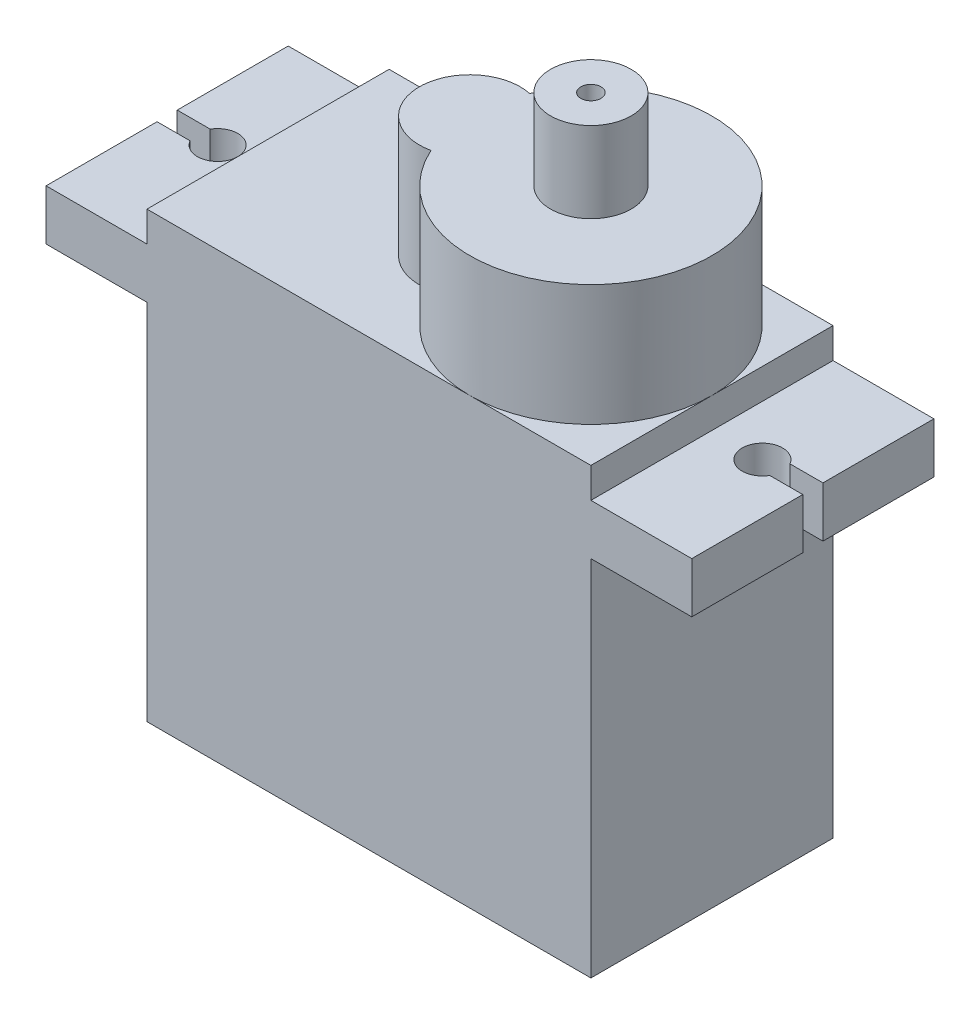
ISO-10303-21;
HEADER;
FILE_DESCRIPTION(('STEP AP214'),'2;1');
FILE_NAME('part.step','',(''),(''),'','','');
FILE_SCHEMA(('AUTOMOTIVE_DESIGN { 1 0 10303 214 1 1 1 1 }'));
ENDSEC;
DATA;
#1=APPLICATION_CONTEXT('core data for automotive mechanical design processes');
#2=APPLICATION_PROTOCOL_DEFINITION('international standard','automotive_design',2000,#1);
#3=PRODUCT_CONTEXT('',#1,'mechanical');
#4=PRODUCT('Part','Part','',(#3));
#5=PRODUCT_RELATED_PRODUCT_CATEGORY('part','',(#4));
#6=PRODUCT_DEFINITION_FORMATION('','',#4);
#7=PRODUCT_DEFINITION_CONTEXT('part definition',#1,'design');
#8=PRODUCT_DEFINITION('design','',#6,#7);
#9=PRODUCT_DEFINITION_SHAPE('','',#8);
#10=(LENGTH_UNIT() NAMED_UNIT(*) SI_UNIT(.MILLI.,.METRE.));
#11=(NAMED_UNIT(*) PLANE_ANGLE_UNIT() SI_UNIT($,.RADIAN.));
#12=(NAMED_UNIT(*) SI_UNIT($,.STERADIAN.) SOLID_ANGLE_UNIT());
#13=UNCERTAINTY_MEASURE_WITH_UNIT(LENGTH_MEASURE(1.E-05),#10,'distance_accuracy_value','');
#14=(GEOMETRIC_REPRESENTATION_CONTEXT(3) GLOBAL_UNCERTAINTY_ASSIGNED_CONTEXT((#13)) GLOBAL_UNIT_ASSIGNED_CONTEXT((#10,
#11,#12)) REPRESENTATION_CONTEXT('',''));
#15=CARTESIAN_POINT('',(0.,0.,0.));
#16=DIRECTION('',(0.,0.,1.));
#17=DIRECTION('',(1.,0.,0.));
#18=AXIS2_PLACEMENT_3D('',#15,#16,#17);
#19=CARTESIAN_POINT('',(-16.,3.90909090909092,12.));
#20=DIRECTION('',(0.,-1.,0.));
#21=DIRECTION('',(0.,0.,-1.));
#22=AXIS2_PLACEMENT_3D('',#19,#20,#21);
#23=PLANE('',#22);
#24=DIRECTION('',(-1.,0.,0.));
#25=VECTOR('',#24,1.);
#26=CARTESIAN_POINT('',(-14.3660254037844,3.90909090909092,6.5));
#27=LINE('',#26,#25);
#28=CARTESIAN_POINT('',(-14.3660254037844,3.90909090909092,6.5));
#29=VERTEX_POINT('',#28);
#30=CARTESIAN_POINT('',(-16.,3.90909090909092,6.5));
#31=VERTEX_POINT('',#30);
#32=EDGE_CURVE('E208',#29,#31,#27,.T.);
#33=ORIENTED_EDGE('',*,*,#32,.T.);
#34=DIRECTION('',(0.,0.,-1.));
#35=VECTOR('',#34,1.);
#36=CARTESIAN_POINT('',(-16.,3.90909090909092,12.));
#37=LINE('',#36,#35);
#38=CARTESIAN_POINT('',(-16.,3.90909090909092,12.));
#39=VERTEX_POINT('',#38);
#40=EDGE_CURVE('E361',#39,#31,#37,.T.);
#41=ORIENTED_EDGE('',*,*,#40,.F.);
#42=DIRECTION('',(-1.,0.,0.));
#43=VECTOR('',#42,1.);
#44=CARTESIAN_POINT('',(-16.,3.90909090909092,12.));
#45=LINE('',#44,#43);
#46=CARTESIAN_POINT('',(-11.,3.90909090909092,12.));
#47=VERTEX_POINT('',#46);
#48=EDGE_CURVE('E286',#47,#39,#45,.T.);
#49=ORIENTED_EDGE('',*,*,#48,.F.);
#50=DIRECTION('',(0.,0.,-1.));
#51=VECTOR('',#50,1.);
#52=CARTESIAN_POINT('',(-11.,3.90909090909092,12.));
#53=LINE('',#52,#51);
#54=CARTESIAN_POINT('',(-11.,3.90909090909092,0.));
#55=VERTEX_POINT('',#54);
#56=EDGE_CURVE('E363',#47,#55,#53,.T.);
#57=ORIENTED_EDGE('',*,*,#56,.T.);
#58=DIRECTION('',(-1.,0.,0.));
#59=VECTOR('',#58,1.);
#60=CARTESIAN_POINT('',(-16.,3.90909090909092,0.));
#61=LINE('',#60,#59);
#62=CARTESIAN_POINT('',(-16.,3.90909090909092,0.));
#63=VERTEX_POINT('',#62);
#64=EDGE_CURVE('E313',#55,#63,#61,.T.);
#65=ORIENTED_EDGE('',*,*,#64,.T.);
#66=CARTESIAN_POINT('',(-16.,3.90909090909092,5.5));
#67=VERTEX_POINT('',#66);
#68=EDGE_CURVE('E360',#67,#63,#37,.T.);
#69=ORIENTED_EDGE('',*,*,#68,.F.);
#70=DIRECTION('',(1.,0.,0.));
#71=VECTOR('',#70,1.);
#72=CARTESIAN_POINT('',(-14.3660254037844,3.90909090909092,5.5));
#73=LINE('',#72,#71);
#74=CARTESIAN_POINT('',(-14.3660254037844,3.90909090909092,5.5));
#75=VERTEX_POINT('',#74);
#76=EDGE_CURVE('E214',#67,#75,#73,.T.);
#77=ORIENTED_EDGE('',*,*,#76,.T.);
#78=CARTESIAN_POINT('',(-13.5,3.90909090909092,6.));
#79=DIRECTION('',(0.,-1.,0.));
#80=DIRECTION('',(1.,0.,0.));
#81=AXIS2_PLACEMENT_3D('',#78,#79,#80);
#82=CIRCLE('',#81,1.);
#83=EDGE_CURVE('E199',#75,#29,#82,.T.);
#84=ORIENTED_EDGE('',*,*,#83,.T.);
#85=EDGE_LOOP('',(#33,#41,#49,#57,#65,#69,#77,#84));
#86=FACE_BOUND('',#85,.T.);
#87=ADVANCED_FACE('F36',(#86),#23,.F.);
#88=CARTESIAN_POINT('',(-16.,1.40909090909092,12.));
#89=DIRECTION('',(1.,0.,0.));
#90=DIRECTION('',(0.,0.,-1.));
#91=AXIS2_PLACEMENT_3D('',#88,#89,#90);
#92=PLANE('',#91);
#93=DIRECTION('',(0.,1.,0.));
#94=VECTOR('',#93,1.);
#95=CARTESIAN_POINT('',(-16.,0.909090909090923,6.5));
#96=LINE('',#95,#94);
#97=CARTESIAN_POINT('',(-16.,1.40909090909092,6.5));
#98=VERTEX_POINT('',#97);
#99=EDGE_CURVE('E205',#98,#31,#96,.T.);
#100=ORIENTED_EDGE('',*,*,#99,.F.);
#101=DIRECTION('',(0.,0.,-1.));
#102=VECTOR('',#101,1.);
#103=CARTESIAN_POINT('',(-16.,1.40909090909092,12.));
#104=LINE('',#103,#102);
#105=CARTESIAN_POINT('',(-16.,1.40909090909092,12.));
#106=VERTEX_POINT('',#105);
#107=EDGE_CURVE('E357',#106,#98,#104,.T.);
#108=ORIENTED_EDGE('',*,*,#107,.F.);
#109=DIRECTION('',(0.,-1.,0.));
#110=VECTOR('',#109,1.);
#111=CARTESIAN_POINT('',(-16.,1.40909090909092,12.));
#112=LINE('',#111,#110);
#113=EDGE_CURVE('E288',#39,#106,#112,.T.);
#114=ORIENTED_EDGE('',*,*,#113,.F.);
#115=ORIENTED_EDGE('',*,*,#40,.T.);
#116=EDGE_LOOP('',(#100,#108,#114,#115));
#117=FACE_BOUND('',#116,.T.);
#118=ADVANCED_FACE('F407',(#117),#92,.F.);
#119=DIRECTION('',(0.,1.,0.));
#120=VECTOR('',#119,1.);
#121=CARTESIAN_POINT('',(-16.,0.909090909090923,5.5));
#122=LINE('',#121,#120);
#123=CARTESIAN_POINT('',(-16.,1.40909090909092,5.5));
#124=VERTEX_POINT('',#123);
#125=EDGE_CURVE('E51',#124,#67,#122,.T.);
#126=ORIENTED_EDGE('',*,*,#125,.T.);
#127=ORIENTED_EDGE('',*,*,#68,.T.);
#128=DIRECTION('',(0.,-1.,0.));
#129=VECTOR('',#128,1.);
#130=CARTESIAN_POINT('',(-16.,1.40909090909092,0.));
#131=LINE('',#130,#129);
#132=CARTESIAN_POINT('',(-16.,1.40909090909092,0.));
#133=VERTEX_POINT('',#132);
#134=EDGE_CURVE('E316',#63,#133,#131,.T.);
#135=ORIENTED_EDGE('',*,*,#134,.T.);
#136=EDGE_CURVE('E356',#124,#133,#104,.T.);
#137=ORIENTED_EDGE('',*,*,#136,.F.);
#138=EDGE_LOOP('',(#126,#127,#135,#137));
#139=FACE_BOUND('',#138,.T.);
#140=ADVANCED_FACE('F412',(#139),#92,.F.);
#141=CARTESIAN_POINT('',(-11.,1.40909090909092,12.));
#142=DIRECTION('',(0.,1.,0.));
#143=DIRECTION('',(-1.,0.,0.));
#144=AXIS2_PLACEMENT_3D('',#141,#142,#143);
#145=PLANE('',#144);
#146=DIRECTION('',(-1.,0.,0.));
#147=VECTOR('',#146,1.);
#148=CARTESIAN_POINT('',(-11.,1.40909090909092,6.5));
#149=LINE('',#148,#147);
#150=CARTESIAN_POINT('',(-14.3660254037844,1.40909090909092,6.5));
#151=VERTEX_POINT('',#150);
#152=EDGE_CURVE('E11',#151,#98,#149,.T.);
#153=ORIENTED_EDGE('',*,*,#152,.F.);
#154=CARTESIAN_POINT('',(-13.5,1.40909090909092,6.));
#155=DIRECTION('',(0.,1.,0.));
#156=DIRECTION('',(-1.,0.,0.));
#157=AXIS2_PLACEMENT_3D('',#154,#155,#156);
#158=CIRCLE('',#157,1.);
#159=CARTESIAN_POINT('',(-14.3660254037844,1.40909090909092,5.5));
#160=VERTEX_POINT('',#159);
#161=EDGE_CURVE('E44',#160,#151,#158,.F.);
#162=ORIENTED_EDGE('',*,*,#161,.F.);
#163=DIRECTION('',(1.,0.,0.));
#164=VECTOR('',#163,1.);
#165=CARTESIAN_POINT('',(-11.,1.40909090909092,5.5));
#166=LINE('',#165,#164);
#167=EDGE_CURVE('E373',#124,#160,#166,.T.);
#168=ORIENTED_EDGE('',*,*,#167,.F.);
#169=ORIENTED_EDGE('',*,*,#136,.T.);
#170=DIRECTION('',(1.,0.,0.));
#171=VECTOR('',#170,1.);
#172=CARTESIAN_POINT('',(-11.,1.40909090909092,0.));
#173=LINE('',#172,#171);
#174=CARTESIAN_POINT('',(-11.,1.40909090909092,0.));
#175=VERTEX_POINT('',#174);
#176=EDGE_CURVE('E319',#133,#175,#173,.T.);
#177=ORIENTED_EDGE('',*,*,#176,.T.);
#178=DIRECTION('',(0.,0.,-1.));
#179=VECTOR('',#178,1.);
#180=CARTESIAN_POINT('',(-11.,1.40909090909092,12.));
#181=LINE('',#180,#179);
#182=CARTESIAN_POINT('',(-11.,1.40909090909092,12.));
#183=VERTEX_POINT('',#182);
#184=EDGE_CURVE('E353',#183,#175,#181,.T.);
#185=ORIENTED_EDGE('',*,*,#184,.F.);
#186=DIRECTION('',(1.,0.,0.));
#187=VECTOR('',#186,1.);
#188=CARTESIAN_POINT('',(-11.,1.40909090909092,12.));
#189=LINE('',#188,#187);
#190=EDGE_CURVE('E290',#106,#183,#189,.T.);
#191=ORIENTED_EDGE('',*,*,#190,.F.);
#192=ORIENTED_EDGE('',*,*,#107,.T.);
#193=EDGE_LOOP('',(#153,#162,#168,#169,#177,#185,#191,#192));
#194=FACE_BOUND('',#193,.T.);
#195=ADVANCED_FACE('F475',(#194),#145,.F.);
#196=CARTESIAN_POINT('',(11.,1.40909090909092,12.));
#197=DIRECTION('',(0.,1.,0.));
#198=DIRECTION('',(-1.,0.,0.));
#199=AXIS2_PLACEMENT_3D('',#196,#197,#198);
#200=PLANE('',#199);
#201=DIRECTION('',(-1.,0.,0.));
#202=VECTOR('',#201,1.);
#203=CARTESIAN_POINT('',(11.,1.40909090909092,6.5));
#204=LINE('',#203,#202);
#205=CARTESIAN_POINT('',(16.,1.40909090909092,6.5));
#206=VERTEX_POINT('',#205);
#207=CARTESIAN_POINT('',(14.3660254037844,1.40909090909092,6.5));
#208=VERTEX_POINT('',#207);
#209=EDGE_CURVE('E245',#206,#208,#204,.T.);
#210=ORIENTED_EDGE('',*,*,#209,.F.);
#211=DIRECTION('',(0.,0.,-1.));
#212=VECTOR('',#211,1.);
#213=CARTESIAN_POINT('',(16.,1.40909090909092,12.));
#214=LINE('',#213,#212);
#215=CARTESIAN_POINT('',(16.,1.40909090909092,12.));
#216=VERTEX_POINT('',#215);
#217=EDGE_CURVE('E341',#216,#206,#214,.T.);
#218=ORIENTED_EDGE('',*,*,#217,.F.);
#219=DIRECTION('',(1.,0.,0.));
#220=VECTOR('',#219,1.);
#221=CARTESIAN_POINT('',(11.,1.40909090909092,12.));
#222=LINE('',#221,#220);
#223=CARTESIAN_POINT('',(11.,1.40909090909092,12.));
#224=VERTEX_POINT('',#223);
#225=EDGE_CURVE('E298',#224,#216,#222,.T.);
#226=ORIENTED_EDGE('',*,*,#225,.F.);
#227=DIRECTION('',(0.,0.,-1.));
#228=VECTOR('',#227,1.);
#229=CARTESIAN_POINT('',(11.,1.40909090909092,12.));
#230=LINE('',#229,#228);
#231=CARTESIAN_POINT('',(11.,1.40909090909092,0.));
#232=VERTEX_POINT('',#231);
#233=EDGE_CURVE('E344',#224,#232,#230,.T.);
#234=ORIENTED_EDGE('',*,*,#233,.T.);
#235=DIRECTION('',(1.,0.,0.));
#236=VECTOR('',#235,1.);
#237=CARTESIAN_POINT('',(11.,1.40909090909092,0.));
#238=LINE('',#237,#236);
#239=CARTESIAN_POINT('',(16.,1.40909090909092,0.));
#240=VERTEX_POINT('',#239);
#241=EDGE_CURVE('E327',#232,#240,#238,.T.);
#242=ORIENTED_EDGE('',*,*,#241,.T.);
#243=CARTESIAN_POINT('',(16.,1.40909090909092,5.5));
#244=VERTEX_POINT('',#243);
#245=EDGE_CURVE('E340',#244,#240,#214,.T.);
#246=ORIENTED_EDGE('',*,*,#245,.F.);
#247=DIRECTION('',(1.,0.,0.));
#248=VECTOR('',#247,1.);
#249=CARTESIAN_POINT('',(11.,1.40909090909092,5.5));
#250=LINE('',#249,#248);
#251=CARTESIAN_POINT('',(14.3660254037844,1.40909090909092,5.5));
#252=VERTEX_POINT('',#251);
#253=EDGE_CURVE('E204',#252,#244,#250,.T.);
#254=ORIENTED_EDGE('',*,*,#253,.F.);
#255=CARTESIAN_POINT('',(13.5,1.40909090909092,6.));
#256=DIRECTION('',(0.,1.,0.));
#257=DIRECTION('',(-1.,0.,0.));
#258=AXIS2_PLACEMENT_3D('',#255,#256,#257);
#259=CIRCLE('',#258,1.);
#260=EDGE_CURVE('E243',#208,#252,#259,.F.);
#261=ORIENTED_EDGE('',*,*,#260,.F.);
#262=EDGE_LOOP('',(#210,#218,#226,#234,#242,#246,#254,#261));
#263=FACE_BOUND('',#262,.T.);
#264=ADVANCED_FACE('F455',(#263),#200,.F.);
#265=CARTESIAN_POINT('',(16.,1.40909090909092,12.));
#266=DIRECTION('',(-1.,0.,0.));
#267=DIRECTION('',(0.,-1.,0.));
#268=AXIS2_PLACEMENT_3D('',#265,#266,#267);
#269=PLANE('',#268);
#270=DIRECTION('',(0.,1.,0.));
#271=VECTOR('',#270,1.);
#272=CARTESIAN_POINT('',(16.,0.909090909090926,6.5));
#273=LINE('',#272,#271);
#274=CARTESIAN_POINT('',(16.,3.90909090909093,6.5));
#275=VERTEX_POINT('',#274);
#276=EDGE_CURVE('E217',#206,#275,#273,.T.);
#277=ORIENTED_EDGE('',*,*,#276,.T.);
#278=DIRECTION('',(0.,0.,-1.));
#279=VECTOR('',#278,1.);
#280=CARTESIAN_POINT('',(16.,3.90909090909092,12.));
#281=LINE('',#280,#279);
#282=CARTESIAN_POINT('',(16.,3.90909090909092,12.));
#283=VERTEX_POINT('',#282);
#284=EDGE_CURVE('E337',#283,#275,#281,.T.);
#285=ORIENTED_EDGE('',*,*,#284,.F.);
#286=DIRECTION('',(0.,1.,0.));
#287=VECTOR('',#286,1.);
#288=CARTESIAN_POINT('',(16.,1.40909090909092,12.));
#289=LINE('',#288,#287);
#290=EDGE_CURVE('E300',#216,#283,#289,.T.);
#291=ORIENTED_EDGE('',*,*,#290,.F.);
#292=ORIENTED_EDGE('',*,*,#217,.T.);
#293=EDGE_LOOP('',(#277,#285,#291,#292));
#294=FACE_BOUND('',#293,.T.);
#295=ADVANCED_FACE('F488',(#294),#269,.F.);
#296=DIRECTION('',(0.,1.,0.));
#297=VECTOR('',#296,1.);
#298=CARTESIAN_POINT('',(16.,0.909090909090926,5.5));
#299=LINE('',#298,#297);
#300=CARTESIAN_POINT('',(16.,3.90909090909092,5.5));
#301=VERTEX_POINT('',#300);
#302=EDGE_CURVE('E59',#244,#301,#299,.T.);
#303=ORIENTED_EDGE('',*,*,#302,.F.);
#304=ORIENTED_EDGE('',*,*,#245,.T.);
#305=DIRECTION('',(0.,1.,0.));
#306=VECTOR('',#305,1.);
#307=CARTESIAN_POINT('',(16.,1.40909090909092,0.));
#308=LINE('',#307,#306);
#309=CARTESIAN_POINT('',(16.,3.90909090909092,0.));
#310=VERTEX_POINT('',#309);
#311=EDGE_CURVE('E330',#240,#310,#308,.T.);
#312=ORIENTED_EDGE('',*,*,#311,.T.);
#313=EDGE_CURVE('E336',#301,#310,#281,.T.);
#314=ORIENTED_EDGE('',*,*,#313,.F.);
#315=EDGE_LOOP('',(#303,#304,#312,#314));
#316=FACE_BOUND('',#315,.T.);
#317=ADVANCED_FACE('F450',(#316),#269,.F.);
#318=CARTESIAN_POINT('',(16.,3.90909090909092,12.));
#319=DIRECTION('',(0.,-1.,0.));
#320=DIRECTION('',(0.,0.,-1.));
#321=AXIS2_PLACEMENT_3D('',#318,#319,#320);
#322=PLANE('',#321);
#323=DIRECTION('',(-1.,0.,0.));
#324=VECTOR('',#323,1.);
#325=CARTESIAN_POINT('',(14.3660254037844,3.90909090909093,6.5));
#326=LINE('',#325,#324);
#327=CARTESIAN_POINT('',(14.3660254037844,3.90909090909093,6.5));
#328=VERTEX_POINT('',#327);
#329=EDGE_CURVE('E230',#275,#328,#326,.T.);
#330=ORIENTED_EDGE('',*,*,#329,.T.);
#331=CARTESIAN_POINT('',(13.5,3.90909090909093,6.));
#332=DIRECTION('',(0.,-1.,0.));
#333=DIRECTION('',(1.,0.,0.));
#334=AXIS2_PLACEMENT_3D('',#331,#332,#333);
#335=CIRCLE('',#334,1.);
#336=CARTESIAN_POINT('',(14.3660254037844,3.90909090909093,5.5));
#337=VERTEX_POINT('',#336);
#338=EDGE_CURVE('E233',#328,#337,#335,.T.);
#339=ORIENTED_EDGE('',*,*,#338,.T.);
#340=DIRECTION('',(1.,0.,0.));
#341=VECTOR('',#340,1.);
#342=CARTESIAN_POINT('',(14.3660254037844,3.90909090909093,5.5));
#343=LINE('',#342,#341);
#344=EDGE_CURVE('E236',#337,#301,#343,.T.);
#345=ORIENTED_EDGE('',*,*,#344,.T.);
#346=ORIENTED_EDGE('',*,*,#313,.T.);
#347=DIRECTION('',(-1.,0.,0.));
#348=VECTOR('',#347,1.);
#349=CARTESIAN_POINT('',(16.,3.90909090909092,0.));
#350=LINE('',#349,#348);
#351=CARTESIAN_POINT('',(11.,3.90909090909092,0.));
#352=VERTEX_POINT('',#351);
#353=EDGE_CURVE('E280',#310,#352,#350,.T.);
#354=ORIENTED_EDGE('',*,*,#353,.T.);
#355=DIRECTION('',(0.,0.,-1.));
#356=VECTOR('',#355,1.);
#357=CARTESIAN_POINT('',(11.,3.90909090909092,12.));
#358=LINE('',#357,#356);
#359=CARTESIAN_POINT('',(11.,3.90909090909092,12.));
#360=VERTEX_POINT('',#359);
#361=EDGE_CURVE('E304',#360,#352,#358,.T.);
#362=ORIENTED_EDGE('',*,*,#361,.F.);
#363=DIRECTION('',(-1.,0.,0.));
#364=VECTOR('',#363,1.);
#365=CARTESIAN_POINT('',(16.,3.90909090909092,12.));
#366=LINE('',#365,#364);
#367=EDGE_CURVE('E302',#283,#360,#366,.T.);
#368=ORIENTED_EDGE('',*,*,#367,.F.);
#369=ORIENTED_EDGE('',*,*,#284,.T.);
#370=EDGE_LOOP('',(#330,#339,#345,#346,#354,#362,#368,#369));
#371=FACE_BOUND('',#370,.T.);
#372=ADVANCED_FACE('F429',(#371),#322,.F.);
#373=CARTESIAN_POINT('',(-11.,5.40909090909092,12.));
#374=DIRECTION('',(0.,-1.,0.));
#375=DIRECTION('',(0.,0.,-1.));
#376=AXIS2_PLACEMENT_3D('',#373,#374,#375);
#377=PLANE('',#376);
#378=CARTESIAN_POINT('',(4.99999999999994,5.40909090909092,6.));
#379=DIRECTION('',(0.,-1.,0.));
#380=DIRECTION('',(0.,0.,-1.));
#381=AXIS2_PLACEMENT_3D('',#378,#379,#380);
#382=CIRCLE('',#381,6.);
#383=CARTESIAN_POINT('',(4.99999999999994,5.40909090909092,12.));
#384=VERTEX_POINT('',#383);
#385=CARTESIAN_POINT('',(-0.479166666666724,5.40909090909092,8.44514470714698));
#386=VERTEX_POINT('',#385);
#387=EDGE_CURVE('E270',#384,#386,#382,.T.);
#388=ORIENTED_EDGE('',*,*,#387,.T.);
#389=CARTESIAN_POINT('',(-1.00000000000006,5.40909090909092,6.));
#390=DIRECTION('',(0.,-1.,0.));
#391=DIRECTION('',(0.,0.,-1.));
#392=AXIS2_PLACEMENT_3D('',#389,#390,#391);
#393=CIRCLE('',#392,2.5);
#394=CARTESIAN_POINT('',(-0.479166666666725,5.40909090909092,3.55485529285302));
#395=VERTEX_POINT('',#394);
#396=EDGE_CURVE('E254',#386,#395,#393,.T.);
#397=ORIENTED_EDGE('',*,*,#396,.T.);
#398=CARTESIAN_POINT('',(4.99999999999994,5.40909090909092,0.));
#399=VERTEX_POINT('',#398);
#400=EDGE_CURVE('E261',#395,#399,#382,.T.);
#401=ORIENTED_EDGE('',*,*,#400,.T.);
#402=DIRECTION('',(-1.,0.,0.));
#403=VECTOR('',#402,1.);
#404=CARTESIAN_POINT('',(-11.,5.40909090909092,0.));
#405=LINE('',#404,#403);
#406=CARTESIAN_POINT('',(-11.,5.40909090909092,0.));
#407=VERTEX_POINT('',#406);
#408=EDGE_CURVE('E307',#399,#407,#405,.T.);
#409=ORIENTED_EDGE('',*,*,#408,.T.);
#410=DIRECTION('',(0.,0.,-1.));
#411=VECTOR('',#410,1.);
#412=CARTESIAN_POINT('',(-11.,5.40909090909092,12.));
#413=LINE('',#412,#411);
#414=CARTESIAN_POINT('',(-11.,5.40909090909092,12.));
#415=VERTEX_POINT('',#414);
#416=EDGE_CURVE('E366',#415,#407,#413,.T.);
#417=ORIENTED_EDGE('',*,*,#416,.F.);
#418=DIRECTION('',(-1.,0.,0.));
#419=VECTOR('',#418,1.);
#420=CARTESIAN_POINT('',(-11.,5.40909090909092,12.));
#421=LINE('',#420,#419);
#422=EDGE_CURVE('E279',#384,#415,#421,.T.);
#423=ORIENTED_EDGE('',*,*,#422,.F.);
#424=EDGE_LOOP('',(#388,#397,#401,#409,#417,#423));
#425=FACE_BOUND('',#424,.T.);
#426=ADVANCED_FACE('F383',(#425),#377,.F.);
#427=CARTESIAN_POINT('',(11.,5.40909090909092,0.));
#428=VERTEX_POINT('',#427);
#429=EDGE_CURVE('E308',#428,#399,#405,.T.);
#430=ORIENTED_EDGE('',*,*,#429,.T.);
#431=CARTESIAN_POINT('',(10.9999999999999,5.40909090909092,6.));
#432=VERTEX_POINT('',#431);
#433=EDGE_CURVE('E269',#399,#432,#382,.T.);
#434=ORIENTED_EDGE('',*,*,#433,.T.);
#435=DIRECTION('',(0.,0.,-1.));
#436=VECTOR('',#435,1.);
#437=CARTESIAN_POINT('',(11.,5.40909090909092,12.));
#438=LINE('',#437,#436);
#439=EDGE_CURVE('E369',#432,#428,#438,.T.);
#440=ORIENTED_EDGE('',*,*,#439,.T.);
#441=EDGE_LOOP('',(#430,#434,#440));
#442=FACE_BOUND('',#441,.T.);
#443=ADVANCED_FACE('F423',(#442),#377,.F.);
#444=CARTESIAN_POINT('',(11.,3.90909090909092,12.));
#445=DIRECTION('',(-1.,0.,0.));
#446=DIRECTION('',(0.,0.,1.));
#447=AXIS2_PLACEMENT_3D('',#444,#445,#446);
#448=PLANE('',#447);
#449=DIRECTION('',(0.,1.,0.));
#450=VECTOR('',#449,1.);
#451=CARTESIAN_POINT('',(11.,3.90909090909092,0.));
#452=LINE('',#451,#450);
#453=EDGE_CURVE('E274',#352,#428,#452,.T.);
#454=ORIENTED_EDGE('',*,*,#453,.T.);
#455=ORIENTED_EDGE('',*,*,#439,.F.);
#456=CARTESIAN_POINT('',(11.,5.40909090909092,12.));
#457=VERTEX_POINT('',#456);
#458=EDGE_CURVE('E370',#457,#432,#438,.T.);
#459=ORIENTED_EDGE('',*,*,#458,.F.);
#460=DIRECTION('',(0.,1.,0.));
#461=VECTOR('',#460,1.);
#462=CARTESIAN_POINT('',(11.,3.90909090909092,12.));
#463=LINE('',#462,#461);
#464=EDGE_CURVE('E276',#360,#457,#463,.T.);
#465=ORIENTED_EDGE('',*,*,#464,.F.);
#466=ORIENTED_EDGE('',*,*,#361,.T.);
#467=EDGE_LOOP('',(#454,#455,#459,#465,#466));
#468=FACE_BOUND('',#467,.T.);
#469=ADVANCED_FACE('F38',(#468),#448,.F.);
#470=ORIENTED_EDGE('',*,*,#458,.T.);
#471=EDGE_CURVE('E375',#432,#384,#382,.T.);
#472=ORIENTED_EDGE('',*,*,#471,.T.);
#473=EDGE_CURVE('E281',#457,#384,#421,.T.);
#474=ORIENTED_EDGE('',*,*,#473,.F.);
#475=EDGE_LOOP('',(#470,#472,#474));
#476=FACE_BOUND('',#475,.T.);
#477=ADVANCED_FACE('F420',(#476),#377,.F.);
#478=CARTESIAN_POINT('',(-11.,3.90909090909092,12.));
#479=DIRECTION('',(1.,0.,0.));
#480=DIRECTION('',(0.,0.,-1.));
#481=AXIS2_PLACEMENT_3D('',#478,#479,#480);
#482=PLANE('',#481);
#483=DIRECTION('',(0.,-1.,0.));
#484=VECTOR('',#483,1.);
#485=CARTESIAN_POINT('',(-11.,3.90909090909092,0.));
#486=LINE('',#485,#484);
#487=EDGE_CURVE('E311',#407,#55,#486,.T.);
#488=ORIENTED_EDGE('',*,*,#487,.T.);
#489=ORIENTED_EDGE('',*,*,#56,.F.);
#490=DIRECTION('',(0.,-1.,0.));
#491=VECTOR('',#490,1.);
#492=CARTESIAN_POINT('',(-11.,3.90909090909092,12.));
#493=LINE('',#492,#491);
#494=EDGE_CURVE('E284',#415,#47,#493,.T.);
#495=ORIENTED_EDGE('',*,*,#494,.F.);
#496=ORIENTED_EDGE('',*,*,#416,.T.);
#497=EDGE_LOOP('',(#488,#489,#495,#496));
#498=FACE_BOUND('',#497,.T.);
#499=ADVANCED_FACE('F417',(#498),#482,.F.);
#500=CARTESIAN_POINT('',(-11.,-16.5909090909091,12.));
#501=DIRECTION('',(1.,0.,0.));
#502=DIRECTION('',(0.,0.,-1.));
#503=AXIS2_PLACEMENT_3D('',#500,#501,#502);
#504=PLANE('',#503);
#505=DIRECTION('',(0.,-1.,0.));
#506=VECTOR('',#505,1.);
#507=CARTESIAN_POINT('',(-11.,-16.5909090909091,0.));
#508=LINE('',#507,#506);
#509=CARTESIAN_POINT('',(-11.,-16.5909090909091,0.));
#510=VERTEX_POINT('',#509);
#511=EDGE_CURVE('E321',#175,#510,#508,.T.);
#512=ORIENTED_EDGE('',*,*,#511,.T.);
#513=DIRECTION('',(0.,0.,-1.));
#514=VECTOR('',#513,1.);
#515=CARTESIAN_POINT('',(-11.,-16.5909090909091,12.));
#516=LINE('',#515,#514);
#517=CARTESIAN_POINT('',(-11.,-16.5909090909091,12.));
#518=VERTEX_POINT('',#517);
#519=EDGE_CURVE('E350',#518,#510,#516,.T.);
#520=ORIENTED_EDGE('',*,*,#519,.F.);
#521=DIRECTION('',(0.,-1.,0.));
#522=VECTOR('',#521,1.);
#523=CARTESIAN_POINT('',(-11.,-16.5909090909091,12.));
#524=LINE('',#523,#522);
#525=EDGE_CURVE('E292',#183,#518,#524,.T.);
#526=ORIENTED_EDGE('',*,*,#525,.F.);
#527=ORIENTED_EDGE('',*,*,#184,.T.);
#528=EDGE_LOOP('',(#512,#520,#526,#527));
#529=FACE_BOUND('',#528,.T.);
#530=ADVANCED_FACE('F419',(#529),#504,.F.);
#531=CARTESIAN_POINT('',(11.,-16.5909090909091,12.));
#532=DIRECTION('',(0.,1.,0.));
#533=DIRECTION('',(0.,0.,1.));
#534=AXIS2_PLACEMENT_3D('',#531,#532,#533);
#535=PLANE('',#534);
#536=CARTESIAN_POINT('',(4.99999999999994,-16.5909090909091,6.));
#537=DIRECTION('',(0.,1.,0.));
#538=DIRECTION('',(0.,0.,1.));
#539=AXIS2_PLACEMENT_3D('',#536,#537,#538);
#540=CIRCLE('',#539,0.500000000000001);
#541=CARTESIAN_POINT('',(4.99999999999994,-16.5909090909091,6.5));
#542=VERTEX_POINT('',#541);
#543=EDGE_CURVE('E223',#542,#542,#540,.T.);
#544=ORIENTED_EDGE('',*,*,#543,.T.);
#545=EDGE_LOOP('',(#544));
#546=FACE_BOUND('',#545,.T.);
#547=DIRECTION('',(1.,0.,0.));
#548=VECTOR('',#547,1.);
#549=CARTESIAN_POINT('',(11.,-16.5909090909091,0.));
#550=LINE('',#549,#548);
#551=CARTESIAN_POINT('',(11.,-16.5909090909091,0.));
#552=VERTEX_POINT('',#551);
#553=EDGE_CURVE('E323',#510,#552,#550,.T.);
#554=ORIENTED_EDGE('',*,*,#553,.T.);
#555=DIRECTION('',(0.,0.,-1.));
#556=VECTOR('',#555,1.);
#557=CARTESIAN_POINT('',(11.,-16.5909090909091,12.));
#558=LINE('',#557,#556);
#559=CARTESIAN_POINT('',(11.,-16.5909090909091,12.));
#560=VERTEX_POINT('',#559);
#561=EDGE_CURVE('E347',#560,#552,#558,.T.);
#562=ORIENTED_EDGE('',*,*,#561,.F.);
#563=DIRECTION('',(1.,0.,0.));
#564=VECTOR('',#563,1.);
#565=CARTESIAN_POINT('',(11.,-16.5909090909091,12.));
#566=LINE('',#565,#564);
#567=EDGE_CURVE('E294',#518,#560,#566,.T.);
#568=ORIENTED_EDGE('',*,*,#567,.F.);
#569=ORIENTED_EDGE('',*,*,#519,.T.);
#570=EDGE_LOOP('',(#554,#562,#568,#569));
#571=FACE_BOUND('',#570,.T.);
#572=ADVANCED_FACE('F467',(#546,#571),#535,.F.);
#573=CARTESIAN_POINT('',(11.,-16.5909090909091,12.));
#574=DIRECTION('',(-1.,0.,0.));
#575=DIRECTION('',(0.,-1.,0.));
#576=AXIS2_PLACEMENT_3D('',#573,#574,#575);
#577=PLANE('',#576);
#578=DIRECTION('',(0.,1.,0.));
#579=VECTOR('',#578,1.);
#580=CARTESIAN_POINT('',(11.,-16.5909090909091,0.));
#581=LINE('',#580,#579);
#582=EDGE_CURVE('E325',#552,#232,#581,.T.);
#583=ORIENTED_EDGE('',*,*,#582,.T.);
#584=ORIENTED_EDGE('',*,*,#233,.F.);
#585=DIRECTION('',(0.,1.,0.));
#586=VECTOR('',#585,1.);
#587=CARTESIAN_POINT('',(11.,-16.5909090909091,12.));
#588=LINE('',#587,#586);
#589=EDGE_CURVE('E296',#560,#224,#588,.T.);
#590=ORIENTED_EDGE('',*,*,#589,.F.);
#591=ORIENTED_EDGE('',*,*,#561,.T.);
#592=EDGE_LOOP('',(#583,#584,#590,#591));
#593=FACE_BOUND('',#592,.T.);
#594=ADVANCED_FACE('F461',(#593),#577,.F.);
#595=CARTESIAN_POINT('',(0.,0.,12.));
#596=DIRECTION('',(0.,0.,-1.));
#597=DIRECTION('',(-1.,0.,0.));
#598=AXIS2_PLACEMENT_3D('',#595,#596,#597);
#599=PLANE('',#598);
#600=ORIENTED_EDGE('',*,*,#464,.T.);
#601=ORIENTED_EDGE('',*,*,#473,.T.);
#602=ORIENTED_EDGE('',*,*,#422,.T.);
#603=ORIENTED_EDGE('',*,*,#494,.T.);
#604=ORIENTED_EDGE('',*,*,#48,.T.);
#605=ORIENTED_EDGE('',*,*,#113,.T.);
#606=ORIENTED_EDGE('',*,*,#190,.T.);
#607=ORIENTED_EDGE('',*,*,#525,.T.);
#608=ORIENTED_EDGE('',*,*,#567,.T.);
#609=ORIENTED_EDGE('',*,*,#589,.T.);
#610=ORIENTED_EDGE('',*,*,#225,.T.);
#611=ORIENTED_EDGE('',*,*,#290,.T.);
#612=ORIENTED_EDGE('',*,*,#367,.T.);
#613=EDGE_LOOP('',(#600,#601,#602,#603,#604,#605,#606,#607,#608,#609,#610,#611,#612));
#614=FACE_BOUND('',#613,.T.);
#615=ADVANCED_FACE('F484',(#614),#599,.F.);
#616=CARTESIAN_POINT('',(0.,0.,0.));
#617=DIRECTION('',(0.,0.,-1.));
#618=DIRECTION('',(-1.,0.,0.));
#619=AXIS2_PLACEMENT_3D('',#616,#617,#618);
#620=PLANE('',#619);
#621=ORIENTED_EDGE('',*,*,#453,.F.);
#622=ORIENTED_EDGE('',*,*,#353,.F.);
#623=ORIENTED_EDGE('',*,*,#311,.F.);
#624=ORIENTED_EDGE('',*,*,#241,.F.);
#625=ORIENTED_EDGE('',*,*,#582,.F.);
#626=ORIENTED_EDGE('',*,*,#553,.F.);
#627=ORIENTED_EDGE('',*,*,#511,.F.);
#628=ORIENTED_EDGE('',*,*,#176,.F.);
#629=ORIENTED_EDGE('',*,*,#134,.F.);
#630=ORIENTED_EDGE('',*,*,#64,.F.);
#631=ORIENTED_EDGE('',*,*,#487,.F.);
#632=ORIENTED_EDGE('',*,*,#408,.F.);
#633=ORIENTED_EDGE('',*,*,#429,.F.);
#634=EDGE_LOOP('',(#621,#622,#623,#624,#625,#626,#627,#628,#629,#630,#631,#632,#633));
#635=FACE_BOUND('',#634,.T.);
#636=ADVANCED_FACE('F437',(#635),#620,.T.);
#637=CARTESIAN_POINT('',(-1.00000000000006,11.4090909090909,6.));
#638=DIRECTION('',(0.,-1.,0.));
#639=DIRECTION('',(0.,0.,-1.));
#640=AXIS2_PLACEMENT_3D('',#637,#638,#639);
#641=CYLINDRICAL_SURFACE('',#640,2.5);
#642=ORIENTED_EDGE('',*,*,#396,.F.);
#643=DIRECTION('',(0.,-1.,0.));
#644=VECTOR('',#643,1.);
#645=CARTESIAN_POINT('',(-0.479166666666724,11.4090909090909,8.44514470714698));
#646=LINE('',#645,#644);
#647=CARTESIAN_POINT('',(-0.479166666666724,11.4090909090909,8.44514470714698));
#648=VERTEX_POINT('',#647);
#649=EDGE_CURVE('E271',#648,#386,#646,.T.);
#650=ORIENTED_EDGE('',*,*,#649,.F.);
#651=CARTESIAN_POINT('',(-1.00000000000006,11.4090909090909,6.));
#652=DIRECTION('',(0.,-1.,0.));
#653=DIRECTION('',(0.,0.,-1.));
#654=AXIS2_PLACEMENT_3D('',#651,#652,#653);
#655=CIRCLE('',#654,2.5);
#656=CARTESIAN_POINT('',(-0.479166666666725,11.4090909090909,3.55485529285302));
#657=VERTEX_POINT('',#656);
#658=EDGE_CURVE('E257',#648,#657,#655,.T.);
#659=ORIENTED_EDGE('',*,*,#658,.T.);
#660=DIRECTION('',(0.,-1.,0.));
#661=VECTOR('',#660,1.);
#662=CARTESIAN_POINT('',(-0.479166666666725,11.4090909090909,3.55485529285302));
#663=LINE('',#662,#661);
#664=EDGE_CURVE('E264',#657,#395,#663,.T.);
#665=ORIENTED_EDGE('',*,*,#664,.T.);
#666=EDGE_LOOP('',(#642,#650,#659,#665));
#667=FACE_BOUND('',#666,.T.);
#668=ADVANCED_FACE('F391',(#667),#641,.T.);
#669=CARTESIAN_POINT('',(4.99999999999994,11.4090909090909,6.));
#670=DIRECTION('',(0.,-1.,0.));
#671=DIRECTION('',(0.,0.,-1.));
#672=AXIS2_PLACEMENT_3D('',#669,#670,#671);
#673=CYLINDRICAL_SURFACE('',#672,6.);
#674=ORIENTED_EDGE('',*,*,#400,.F.);
#675=ORIENTED_EDGE('',*,*,#664,.F.);
#676=CARTESIAN_POINT('',(4.99999999999994,11.4090909090909,6.));
#677=DIRECTION('',(0.,-1.,0.));
#678=DIRECTION('',(0.,0.,-1.));
#679=AXIS2_PLACEMENT_3D('',#676,#677,#678);
#680=CIRCLE('',#679,6.);
#681=EDGE_CURVE('E260',#657,#648,#680,.T.);
#682=ORIENTED_EDGE('',*,*,#681,.T.);
#683=ORIENTED_EDGE('',*,*,#649,.T.);
#684=ORIENTED_EDGE('',*,*,#387,.F.);
#685=ORIENTED_EDGE('',*,*,#471,.F.);
#686=ORIENTED_EDGE('',*,*,#433,.F.);
#687=EDGE_LOOP('',(#674,#675,#682,#683,#684,#685,#686));
#688=FACE_BOUND('',#687,.T.);
#689=ADVANCED_FACE('F387',(#688),#673,.T.);
#690=CARTESIAN_POINT('',(1.99999999999994,11.4090909090909,6.));
#691=DIRECTION('',(0.,-1.,0.));
#692=DIRECTION('',(0.,0.,-1.));
#693=AXIS2_PLACEMENT_3D('',#690,#691,#692);
#694=PLANE('',#693);
#695=CARTESIAN_POINT('',(4.99999999999994,11.4090909090909,6.));
#696=DIRECTION('',(0.,-1.,0.));
#697=DIRECTION('',(0.,0.,-1.));
#698=AXIS2_PLACEMENT_3D('',#695,#696,#697);
#699=CIRCLE('',#698,2.);
#700=CARTESIAN_POINT('',(4.99999999999994,11.4090909090909,4.));
#701=VERTEX_POINT('',#700);
#702=EDGE_CURVE('E250',#701,#701,#699,.T.);
#703=ORIENTED_EDGE('',*,*,#702,.T.);
#704=EDGE_LOOP('',(#703));
#705=FACE_BOUND('',#704,.T.);
#706=ORIENTED_EDGE('',*,*,#658,.F.);
#707=ORIENTED_EDGE('',*,*,#681,.F.);
#708=EDGE_LOOP('',(#706,#707));
#709=FACE_BOUND('',#708,.T.);
#710=ADVANCED_FACE('F393',(#705,#709),#694,.F.);
#711=CARTESIAN_POINT('',(4.99999999999994,15.4090909090909,6.));
#712=DIRECTION('',(0.,-1.,0.));
#713=DIRECTION('',(0.,0.,-1.));
#714=AXIS2_PLACEMENT_3D('',#711,#712,#713);
#715=CYLINDRICAL_SURFACE('',#714,2.);
#716=CARTESIAN_POINT('',(4.99999999999994,15.4090909090909,6.));
#717=DIRECTION('',(0.,-1.,0.));
#718=DIRECTION('',(0.,0.,-1.));
#719=AXIS2_PLACEMENT_3D('',#716,#717,#718);
#720=CIRCLE('',#719,2.);
#721=CARTESIAN_POINT('',(4.99999999999994,15.4090909090909,4.));
#722=VERTEX_POINT('',#721);
#723=EDGE_CURVE('E251',#722,#722,#720,.T.);
#724=ORIENTED_EDGE('',*,*,#723,.T.);
#725=EDGE_LOOP('',(#724));
#726=FACE_BOUND('',#725,.T.);
#727=ORIENTED_EDGE('',*,*,#702,.F.);
#728=EDGE_LOOP('',(#727));
#729=FACE_BOUND('',#728,.T.);
#730=ADVANCED_FACE('F395',(#726,#729),#715,.T.);
#731=CARTESIAN_POINT('',(4.99999999999994,15.4090909090909,6.));
#732=DIRECTION('',(0.,-1.,0.));
#733=DIRECTION('',(0.,0.,-1.));
#734=AXIS2_PLACEMENT_3D('',#731,#732,#733);
#735=PLANE('',#734);
#736=CARTESIAN_POINT('',(4.99999999999994,15.4090909090909,6.));
#737=DIRECTION('',(0.,-1.,0.));
#738=DIRECTION('',(0.,0.,-1.));
#739=AXIS2_PLACEMENT_3D('',#736,#737,#738);
#740=CIRCLE('',#739,0.5);
#741=CARTESIAN_POINT('',(4.99999999999994,15.4090909090909,5.5));
#742=VERTEX_POINT('',#741);
#743=EDGE_CURVE('E247',#742,#742,#740,.T.);
#744=ORIENTED_EDGE('',*,*,#743,.T.);
#745=EDGE_LOOP('',(#744));
#746=FACE_BOUND('',#745,.T.);
#747=ORIENTED_EDGE('',*,*,#723,.F.);
#748=EDGE_LOOP('',(#747));
#749=FACE_BOUND('',#748,.T.);
#750=ADVANCED_FACE('F402',(#746,#749),#735,.F.);
#751=CARTESIAN_POINT('',(4.99999999999994,15.4090909090909,6.));
#752=DIRECTION('',(0.,-1.,0.));
#753=DIRECTION('',(0.,0.,-1.));
#754=AXIS2_PLACEMENT_3D('',#751,#752,#753);
#755=CYLINDRICAL_SURFACE('',#754,0.5);
#756=ORIENTED_EDGE('',*,*,#743,.F.);
#757=EDGE_LOOP('',(#756));
#758=FACE_BOUND('',#757,.T.);
#759=ORIENTED_EDGE('',*,*,#543,.F.);
#760=EDGE_LOOP('',(#759));
#761=FACE_BOUND('',#760,.T.);
#762=ADVANCED_FACE('F510',(#758,#761),#755,.F.);
#763=CARTESIAN_POINT('',(14.3660254037844,0.909090909090925,6.5));
#764=DIRECTION('',(0.,0.,-1.));
#765=DIRECTION('',(-1.,0.,0.));
#766=AXIS2_PLACEMENT_3D('',#763,#764,#765);
#767=PLANE('',#766);
#768=ORIENTED_EDGE('',*,*,#209,.T.);
#769=DIRECTION('',(0.,1.,0.));
#770=VECTOR('',#769,1.);
#771=CARTESIAN_POINT('',(14.3660254037844,0.909090909090925,6.5));
#772=LINE('',#771,#770);
#773=EDGE_CURVE('E220',#208,#328,#772,.T.);
#774=ORIENTED_EDGE('',*,*,#773,.T.);
#775=ORIENTED_EDGE('',*,*,#329,.F.);
#776=ORIENTED_EDGE('',*,*,#276,.F.);
#777=EDGE_LOOP('',(#768,#774,#775,#776));
#778=FACE_BOUND('',#777,.T.);
#779=ADVANCED_FACE('F491',(#778),#767,.T.);
#780=CARTESIAN_POINT('',(13.5,0.909090909090925,6.));
#781=DIRECTION('',(0.,1.,0.));
#782=DIRECTION('',(-1.,0.,0.));
#783=AXIS2_PLACEMENT_3D('',#780,#781,#782);
#784=CYLINDRICAL_SURFACE('',#783,1.);
#785=ORIENTED_EDGE('',*,*,#260,.T.);
#786=DIRECTION('',(0.,1.,0.));
#787=VECTOR('',#786,1.);
#788=CARTESIAN_POINT('',(14.3660254037844,0.909090909090925,5.5));
#789=LINE('',#788,#787);
#790=EDGE_CURVE('E239',#252,#337,#789,.T.);
#791=ORIENTED_EDGE('',*,*,#790,.T.);
#792=ORIENTED_EDGE('',*,*,#338,.F.);
#793=ORIENTED_EDGE('',*,*,#773,.F.);
#794=EDGE_LOOP('',(#785,#791,#792,#793));
#795=FACE_BOUND('',#794,.T.);
#796=ADVANCED_FACE('F495',(#795),#784,.F.);
#797=CARTESIAN_POINT('',(14.3660254037844,0.909090909090925,5.5));
#798=DIRECTION('',(0.,0.,1.));
#799=DIRECTION('',(1.,0.,0.));
#800=AXIS2_PLACEMENT_3D('',#797,#798,#799);
#801=PLANE('',#800);
#802=ORIENTED_EDGE('',*,*,#253,.T.);
#803=ORIENTED_EDGE('',*,*,#302,.T.);
#804=ORIENTED_EDGE('',*,*,#344,.F.);
#805=ORIENTED_EDGE('',*,*,#790,.F.);
#806=EDGE_LOOP('',(#802,#803,#804,#805));
#807=FACE_BOUND('',#806,.T.);
#808=ADVANCED_FACE('F497',(#807),#801,.T.);
#809=CARTESIAN_POINT('',(-13.5,0.909090909090924,6.));
#810=DIRECTION('',(0.,1.,0.));
#811=DIRECTION('',(-1.,0.,0.));
#812=AXIS2_PLACEMENT_3D('',#809,#810,#811);
#813=CYLINDRICAL_SURFACE('',#812,1.);
#814=ORIENTED_EDGE('',*,*,#161,.T.);
#815=DIRECTION('',(0.,1.,0.));
#816=VECTOR('',#815,1.);
#817=CARTESIAN_POINT('',(-14.3660254037844,0.909090909090924,6.5));
#818=LINE('',#817,#816);
#819=EDGE_CURVE('E194',#151,#29,#818,.T.);
#820=ORIENTED_EDGE('',*,*,#819,.T.);
#821=ORIENTED_EDGE('',*,*,#83,.F.);
#822=DIRECTION('',(0.,1.,0.));
#823=VECTOR('',#822,1.);
#824=CARTESIAN_POINT('',(-14.3660254037844,0.909090909090924,5.5));
#825=LINE('',#824,#823);
#826=EDGE_CURVE('E226',#160,#75,#825,.T.);
#827=ORIENTED_EDGE('',*,*,#826,.F.);
#828=EDGE_LOOP('',(#814,#820,#821,#827));
#829=FACE_BOUND('',#828,.T.);
#830=ADVANCED_FACE('F196',(#829),#813,.F.);
#831=CARTESIAN_POINT('',(-14.3660254037844,0.909090909090924,6.5));
#832=DIRECTION('',(0.,0.,-1.));
#833=DIRECTION('',(-1.,0.,0.));
#834=AXIS2_PLACEMENT_3D('',#831,#832,#833);
#835=PLANE('',#834);
#836=ORIENTED_EDGE('',*,*,#152,.T.);
#837=ORIENTED_EDGE('',*,*,#99,.T.);
#838=ORIENTED_EDGE('',*,*,#32,.F.);
#839=ORIENTED_EDGE('',*,*,#819,.F.);
#840=EDGE_LOOP('',(#836,#837,#838,#839));
#841=FACE_BOUND('',#840,.T.);
#842=ADVANCED_FACE('F209',(#841),#835,.T.);
#843=CARTESIAN_POINT('',(-14.3660254037844,0.909090909090924,5.5));
#844=DIRECTION('',(0.,0.,1.));
#845=DIRECTION('',(1.,0.,0.));
#846=AXIS2_PLACEMENT_3D('',#843,#844,#845);
#847=PLANE('',#846);
#848=ORIENTED_EDGE('',*,*,#167,.T.);
#849=ORIENTED_EDGE('',*,*,#826,.T.);
#850=ORIENTED_EDGE('',*,*,#76,.F.);
#851=ORIENTED_EDGE('',*,*,#125,.F.);
#852=EDGE_LOOP('',(#848,#849,#850,#851));
#853=FACE_BOUND('',#852,.T.);
#854=ADVANCED_FACE('F646',(#853),#847,.T.);
#855=CLOSED_SHELL('',(#87,#118,#140,#195,#264,#295,#317,#372,#426,#443,#469,#477,#499,#530,#572,
#594,#615,#636,#668,#689,#710,#730,#750,#762,#779,#796,#808,#830,#842,#854));
#856=MANIFOLD_SOLID_BREP('B2',#855);
#857=ADVANCED_BREP_SHAPE_REPRESENTATION('',(#18,#856),#14);
#858=SHAPE_DEFINITION_REPRESENTATION(#9,#857);
ENDSEC;
END-ISO-10303-21;
